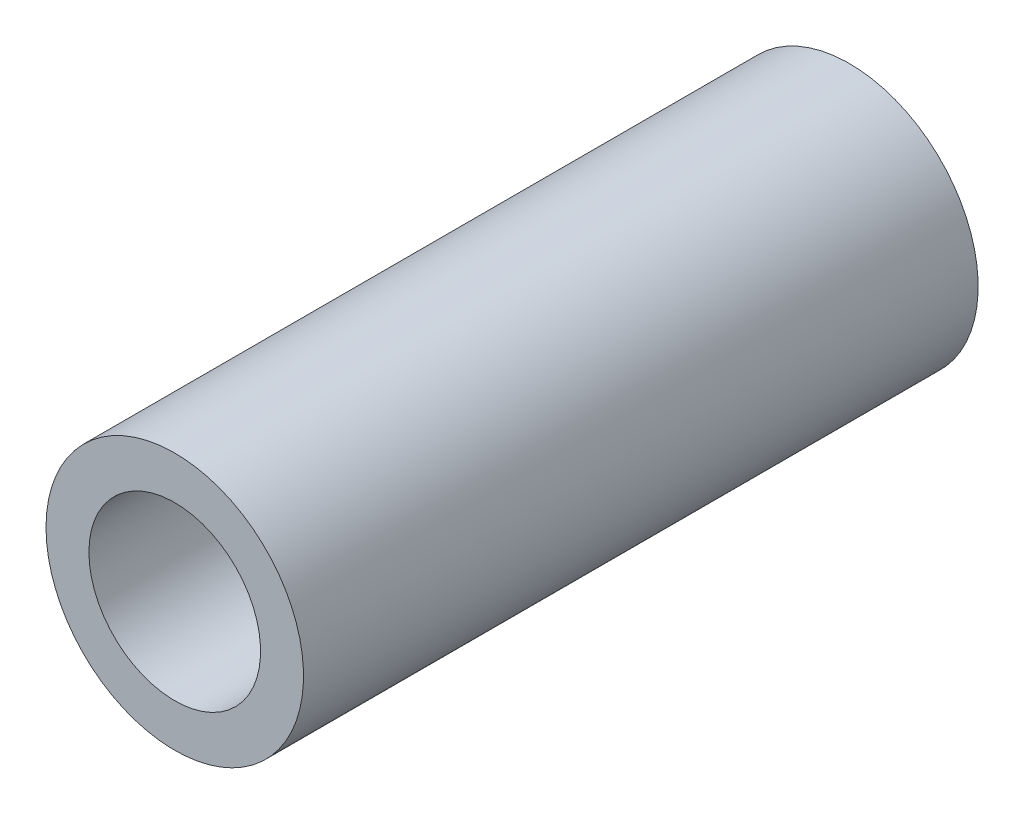
ISO-10303-21;
HEADER;
FILE_DESCRIPTION(('STEP AP214'),'2;1');
FILE_NAME('part.step','',(''),(''),'','','');
FILE_SCHEMA(('AUTOMOTIVE_DESIGN { 1 0 10303 214 1 1 1 1 }'));
ENDSEC;
DATA;
#1=APPLICATION_CONTEXT('core data for automotive mechanical design processes');
#2=APPLICATION_PROTOCOL_DEFINITION('international standard','automotive_design',2000,#1);
#3=PRODUCT_CONTEXT('',#1,'mechanical');
#4=PRODUCT('Part','Part','',(#3));
#5=PRODUCT_RELATED_PRODUCT_CATEGORY('part','',(#4));
#6=PRODUCT_DEFINITION_FORMATION('','',#4);
#7=PRODUCT_DEFINITION_CONTEXT('part definition',#1,'design');
#8=PRODUCT_DEFINITION('design','',#6,#7);
#9=PRODUCT_DEFINITION_SHAPE('','',#8);
#10=(LENGTH_UNIT() NAMED_UNIT(*) SI_UNIT(.MILLI.,.METRE.));
#11=(NAMED_UNIT(*) PLANE_ANGLE_UNIT() SI_UNIT($,.RADIAN.));
#12=(NAMED_UNIT(*) SI_UNIT($,.STERADIAN.) SOLID_ANGLE_UNIT());
#13=UNCERTAINTY_MEASURE_WITH_UNIT(LENGTH_MEASURE(1.E-05),#10,'distance_accuracy_value','');
#14=(GEOMETRIC_REPRESENTATION_CONTEXT(3) GLOBAL_UNCERTAINTY_ASSIGNED_CONTEXT((#13)) GLOBAL_UNIT_ASSIGNED_CONTEXT((#10,
#11,#12)) REPRESENTATION_CONTEXT('',''));
#15=CARTESIAN_POINT('',(0.,0.,0.));
#16=DIRECTION('',(0.,0.,1.));
#17=DIRECTION('',(1.,0.,0.));
#18=AXIS2_PLACEMENT_3D('',#15,#16,#17);
#19=CARTESIAN_POINT('',(0.,0.,12.47775));
#20=DIRECTION('',(0.,0.,1.));
#21=DIRECTION('',(1.,0.,0.));
#22=AXIS2_PLACEMENT_3D('',#19,#20,#21);
#23=PLANE('',#22);
#24=CARTESIAN_POINT('',(0.,0.,12.47775));
#25=DIRECTION('',(0.,0.,1.));
#26=DIRECTION('',(1.,0.,0.));
#27=AXIS2_PLACEMENT_3D('',#24,#25,#26);
#28=CIRCLE('',#27,2.38125);
#29=CARTESIAN_POINT('',(-2.38125,0.,12.47775));
#30=VERTEX_POINT('',#29);
#31=EDGE_CURVE('E10',#30,#30,#28,.T.);
#32=ORIENTED_EDGE('',*,*,#31,.T.);
#33=EDGE_LOOP('',(#32));
#34=FACE_BOUND('',#33,.T.);
#35=CARTESIAN_POINT('',(0.,0.,12.47775));
#36=DIRECTION('',(0.,0.,1.));
#37=DIRECTION('',(1.,0.,0.));
#38=AXIS2_PLACEMENT_3D('',#35,#36,#37);
#39=CIRCLE('',#38,1.5875);
#40=CARTESIAN_POINT('',(-1.5875,0.,12.47775));
#41=VERTEX_POINT('',#40);
#42=EDGE_CURVE('E56',#41,#41,#39,.T.);
#43=ORIENTED_EDGE('',*,*,#42,.F.);
#44=EDGE_LOOP('',(#43));
#45=FACE_BOUND('',#44,.T.);
#46=ADVANCED_FACE('F43',(#34,#45),#23,.T.);
#47=CARTESIAN_POINT('',(0.,0.,0.));
#48=DIRECTION('',(0.,0.,1.));
#49=DIRECTION('',(1.,0.,0.));
#50=AXIS2_PLACEMENT_3D('',#47,#48,#49);
#51=PLANE('',#50);
#52=CARTESIAN_POINT('',(0.,0.,0.));
#53=DIRECTION('',(0.,0.,1.));
#54=DIRECTION('',(1.,0.,0.));
#55=AXIS2_PLACEMENT_3D('',#52,#53,#54);
#56=CIRCLE('',#55,2.38125);
#57=CARTESIAN_POINT('',(-2.38125,0.,0.));
#58=VERTEX_POINT('',#57);
#59=EDGE_CURVE('E47',#58,#58,#56,.T.);
#60=ORIENTED_EDGE('',*,*,#59,.F.);
#61=EDGE_LOOP('',(#60));
#62=FACE_BOUND('',#61,.T.);
#63=CARTESIAN_POINT('',(0.,0.,0.));
#64=DIRECTION('',(0.,0.,1.));
#65=DIRECTION('',(1.,0.,0.));
#66=AXIS2_PLACEMENT_3D('',#63,#64,#65);
#67=CIRCLE('',#66,1.5875);
#68=CARTESIAN_POINT('',(-1.5875,0.,0.));
#69=VERTEX_POINT('',#68);
#70=EDGE_CURVE('E58',#69,#69,#67,.T.);
#71=ORIENTED_EDGE('',*,*,#70,.T.);
#72=EDGE_LOOP('',(#71));
#73=FACE_BOUND('',#72,.T.);
#74=ADVANCED_FACE('F70',(#62,#73),#51,.F.);
#75=CARTESIAN_POINT('',(0.,0.,12.47775));
#76=DIRECTION('',(0.,0.,-1.));
#77=DIRECTION('',(-1.,0.,0.));
#78=AXIS2_PLACEMENT_3D('',#75,#76,#77);
#79=CYLINDRICAL_SURFACE('',#78,2.38125);
#80=CARTESIAN_POINT('',(-2.38125,0.,12.47775));
#81=CARTESIAN_POINT('',(-2.38125,0.,12.3477734375));
#82=CARTESIAN_POINT('',(-2.38125,0.,12.217796875));
#83=CARTESIAN_POINT('',(-2.38125,0.,11.95784375));
#84=CARTESIAN_POINT('',(-2.38125,0.,11.8278671875));
#85=CARTESIAN_POINT('',(-2.38125,0.,11.5679140625));
#86=CARTESIAN_POINT('',(-2.38125,0.,11.4379375));
#87=CARTESIAN_POINT('',(-2.38125,0.,11.177984375));
#88=CARTESIAN_POINT('',(-2.38125,0.,11.0480078125));
#89=CARTESIAN_POINT('',(-2.38125,0.,10.7880546875));
#90=CARTESIAN_POINT('',(-2.38125,0.,10.658078125));
#91=CARTESIAN_POINT('',(-2.38125,0.,10.398125));
#92=CARTESIAN_POINT('',(-2.38125,0.,10.2681484375));
#93=CARTESIAN_POINT('',(-2.38125,0.,10.0081953125));
#94=CARTESIAN_POINT('',(-2.38125,0.,9.87821875));
#95=CARTESIAN_POINT('',(-2.38125,0.,9.618265625));
#96=CARTESIAN_POINT('',(-2.38125,0.,9.4882890625));
#97=CARTESIAN_POINT('',(-2.38125,0.,9.2283359375));
#98=CARTESIAN_POINT('',(-2.38125,0.,9.098359375));
#99=CARTESIAN_POINT('',(-2.38125,0.,8.83840625));
#100=CARTESIAN_POINT('',(-2.38125,0.,8.7084296875));
#101=CARTESIAN_POINT('',(-2.38125,0.,8.4484765625));
#102=CARTESIAN_POINT('',(-2.38125,0.,8.3185));
#103=CARTESIAN_POINT('',(-2.38125,0.,8.058546875));
#104=CARTESIAN_POINT('',(-2.38125,0.,7.9285703125));
#105=CARTESIAN_POINT('',(-2.38125,0.,7.6686171875));
#106=CARTESIAN_POINT('',(-2.38125,0.,7.538640625));
#107=CARTESIAN_POINT('',(-2.38125,0.,7.2786875));
#108=CARTESIAN_POINT('',(-2.38125,0.,7.1487109375));
#109=CARTESIAN_POINT('',(-2.38125,0.,6.8887578125));
#110=CARTESIAN_POINT('',(-2.38125,0.,6.75878125));
#111=CARTESIAN_POINT('',(-2.38125,0.,6.498828125));
#112=CARTESIAN_POINT('',(-2.38125,0.,6.3688515625));
#113=CARTESIAN_POINT('',(-2.38125,0.,6.1088984375));
#114=CARTESIAN_POINT('',(-2.38125,0.,5.978921875));
#115=CARTESIAN_POINT('',(-2.38125,0.,5.71896875));
#116=CARTESIAN_POINT('',(-2.38125,0.,5.5889921875));
#117=CARTESIAN_POINT('',(-2.38125,0.,5.3290390625));
#118=CARTESIAN_POINT('',(-2.38125,0.,5.1990625));
#119=CARTESIAN_POINT('',(-2.38125,0.,4.939109375));
#120=CARTESIAN_POINT('',(-2.38125,0.,4.8091328125));
#121=CARTESIAN_POINT('',(-2.38125,0.,4.5491796875));
#122=CARTESIAN_POINT('',(-2.38125,0.,4.419203125));
#123=CARTESIAN_POINT('',(-2.38125,0.,4.15925));
#124=CARTESIAN_POINT('',(-2.38125,0.,4.0292734375));
#125=CARTESIAN_POINT('',(-2.38125,0.,3.7693203125));
#126=CARTESIAN_POINT('',(-2.38125,0.,3.63934375));
#127=CARTESIAN_POINT('',(-2.38125,0.,3.379390625));
#128=CARTESIAN_POINT('',(-2.38125,0.,3.2494140625));
#129=CARTESIAN_POINT('',(-2.38125,0.,2.9894609375));
#130=CARTESIAN_POINT('',(-2.38125,0.,2.859484375));
#131=CARTESIAN_POINT('',(-2.38125,0.,2.59953125));
#132=CARTESIAN_POINT('',(-2.38125,0.,2.4695546875));
#133=CARTESIAN_POINT('',(-2.38125,0.,2.2096015625));
#134=CARTESIAN_POINT('',(-2.38125,0.,2.079625));
#135=CARTESIAN_POINT('',(-2.38125,0.,1.819671875));
#136=CARTESIAN_POINT('',(-2.38125,0.,1.6896953125));
#137=CARTESIAN_POINT('',(-2.38125,0.,1.4297421875));
#138=CARTESIAN_POINT('',(-2.38125,0.,1.299765625));
#139=CARTESIAN_POINT('',(-2.38125,0.,1.0398125));
#140=CARTESIAN_POINT('',(-2.38125,0.,0.909835937500001));
#141=CARTESIAN_POINT('',(-2.38125,0.,0.6498828125));
#142=CARTESIAN_POINT('',(-2.38125,0.,0.51990625));
#143=CARTESIAN_POINT('',(-2.38125,0.,0.259953125));
#144=CARTESIAN_POINT('',(-2.38125,0.,0.1299765625));
#145=CARTESIAN_POINT('',(-2.38125,0.,0.));
#146=B_SPLINE_CURVE_WITH_KNOTS('',3,(#80,#81,#82,#83,#84,#85,#86,#87,#88,#89,#90,#91,#92,#93,
#94,#95,#96,#97,#98,#99,#100,#101,#102,#103,#104,#105,#106,#107,#108,#109,#110,#111,#112,#113,
#114,#115,#116,#117,#118,#119,#120,#121,#122,#123,#124,#125,#126,#127,#128,#129,#130,#131,#132,
#133,#134,#135,#136,#137,#138,#139,#140,#141,#142,#143,#144,#145),.UNSPECIFIED.,.F.,.F.,(4,2,2,
2,2,2,2,2,2,2,2,2,2,2,2,2,2,2,2,2,2,2,2,2,2,2,2,2,2,2,2,2,4),(0.,0.389929687499999,
0.779859374999999,1.1697890625,1.55971875,1.9496484375,2.339578125,2.7295078125,3.1194375,
3.5093671875,3.899296875,4.2892265625,4.67915625,5.0690859375,5.459015625,5.8489453125,6.238875,
6.6288046875,7.018734375,7.4086640625,7.79859375,8.1885234375,8.578453125,8.9683828125,
9.3583125,9.7482421875,10.138171875,10.5281015625,10.91803125,11.3079609375,11.697890625,
12.0878203125,12.47775),.UNSPECIFIED.);
#147=EDGE_CURVE('BSEAM45',#30,#58,#146,.T.);
#148=ORIENTED_EDGE('',*,*,#31,.F.);
#149=ORIENTED_EDGE('',*,*,#59,.T.);
#150=ORIENTED_EDGE('',*,*,#147,.T.);
#151=ORIENTED_EDGE('',*,*,#147,.F.);
#152=EDGE_LOOP('',(#148,#150,#149,#151));
#153=FACE_BOUND('',#152,.T.);
#154=ADVANCED_FACE('F45',(#153),#79,.T.);
#155=CARTESIAN_POINT('',(0.,0.,12.47775));
#156=DIRECTION('',(0.,0.,-1.));
#157=DIRECTION('',(-1.,0.,0.));
#158=AXIS2_PLACEMENT_3D('',#155,#156,#157);
#159=CYLINDRICAL_SURFACE('',#158,1.5875);
#160=CARTESIAN_POINT('',(-1.5875,0.,12.47775));
#161=CARTESIAN_POINT('',(-1.5875,0.,12.3477734375));
#162=CARTESIAN_POINT('',(-1.5875,0.,12.217796875));
#163=CARTESIAN_POINT('',(-1.5875,0.,11.95784375));
#164=CARTESIAN_POINT('',(-1.5875,0.,11.8278671875));
#165=CARTESIAN_POINT('',(-1.5875,0.,11.5679140625));
#166=CARTESIAN_POINT('',(-1.5875,0.,11.4379375));
#167=CARTESIAN_POINT('',(-1.5875,0.,11.177984375));
#168=CARTESIAN_POINT('',(-1.5875,0.,11.0480078125));
#169=CARTESIAN_POINT('',(-1.5875,0.,10.7880546875));
#170=CARTESIAN_POINT('',(-1.5875,0.,10.658078125));
#171=CARTESIAN_POINT('',(-1.5875,0.,10.398125));
#172=CARTESIAN_POINT('',(-1.5875,0.,10.2681484375));
#173=CARTESIAN_POINT('',(-1.5875,0.,10.0081953125));
#174=CARTESIAN_POINT('',(-1.5875,0.,9.87821875));
#175=CARTESIAN_POINT('',(-1.5875,0.,9.618265625));
#176=CARTESIAN_POINT('',(-1.5875,0.,9.4882890625));
#177=CARTESIAN_POINT('',(-1.5875,0.,9.2283359375));
#178=CARTESIAN_POINT('',(-1.5875,0.,9.098359375));
#179=CARTESIAN_POINT('',(-1.5875,0.,8.83840625));
#180=CARTESIAN_POINT('',(-1.5875,0.,8.7084296875));
#181=CARTESIAN_POINT('',(-1.5875,0.,8.4484765625));
#182=CARTESIAN_POINT('',(-1.5875,0.,8.3185));
#183=CARTESIAN_POINT('',(-1.5875,0.,8.058546875));
#184=CARTESIAN_POINT('',(-1.5875,0.,7.9285703125));
#185=CARTESIAN_POINT('',(-1.5875,0.,7.6686171875));
#186=CARTESIAN_POINT('',(-1.5875,0.,7.538640625));
#187=CARTESIAN_POINT('',(-1.5875,0.,7.2786875));
#188=CARTESIAN_POINT('',(-1.5875,0.,7.1487109375));
#189=CARTESIAN_POINT('',(-1.5875,0.,6.8887578125));
#190=CARTESIAN_POINT('',(-1.5875,0.,6.75878125));
#191=CARTESIAN_POINT('',(-1.5875,0.,6.498828125));
#192=CARTESIAN_POINT('',(-1.5875,0.,6.3688515625));
#193=CARTESIAN_POINT('',(-1.5875,0.,6.1088984375));
#194=CARTESIAN_POINT('',(-1.5875,0.,5.978921875));
#195=CARTESIAN_POINT('',(-1.5875,0.,5.71896875));
#196=CARTESIAN_POINT('',(-1.5875,0.,5.5889921875));
#197=CARTESIAN_POINT('',(-1.5875,0.,5.3290390625));
#198=CARTESIAN_POINT('',(-1.5875,0.,5.1990625));
#199=CARTESIAN_POINT('',(-1.5875,0.,4.939109375));
#200=CARTESIAN_POINT('',(-1.5875,0.,4.8091328125));
#201=CARTESIAN_POINT('',(-1.5875,0.,4.5491796875));
#202=CARTESIAN_POINT('',(-1.5875,0.,4.419203125));
#203=CARTESIAN_POINT('',(-1.5875,0.,4.15925));
#204=CARTESIAN_POINT('',(-1.5875,0.,4.0292734375));
#205=CARTESIAN_POINT('',(-1.5875,0.,3.7693203125));
#206=CARTESIAN_POINT('',(-1.5875,0.,3.63934375));
#207=CARTESIAN_POINT('',(-1.5875,0.,3.379390625));
#208=CARTESIAN_POINT('',(-1.5875,0.,3.2494140625));
#209=CARTESIAN_POINT('',(-1.5875,0.,2.9894609375));
#210=CARTESIAN_POINT('',(-1.5875,0.,2.859484375));
#211=CARTESIAN_POINT('',(-1.5875,0.,2.59953125));
#212=CARTESIAN_POINT('',(-1.5875,0.,2.4695546875));
#213=CARTESIAN_POINT('',(-1.5875,0.,2.2096015625));
#214=CARTESIAN_POINT('',(-1.5875,0.,2.079625));
#215=CARTESIAN_POINT('',(-1.5875,0.,1.819671875));
#216=CARTESIAN_POINT('',(-1.5875,0.,1.6896953125));
#217=CARTESIAN_POINT('',(-1.5875,0.,1.4297421875));
#218=CARTESIAN_POINT('',(-1.5875,0.,1.299765625));
#219=CARTESIAN_POINT('',(-1.5875,0.,1.0398125));
#220=CARTESIAN_POINT('',(-1.5875,0.,0.909835937500001));
#221=CARTESIAN_POINT('',(-1.5875,0.,0.6498828125));
#222=CARTESIAN_POINT('',(-1.5875,0.,0.51990625));
#223=CARTESIAN_POINT('',(-1.5875,0.,0.259953125));
#224=CARTESIAN_POINT('',(-1.5875,0.,0.1299765625));
#225=CARTESIAN_POINT('',(-1.5875,0.,0.));
#226=B_SPLINE_CURVE_WITH_KNOTS('',3,(#160,#161,#162,#163,#164,#165,#166,#167,#168,#169,#170,
#171,#172,#173,#174,#175,#176,#177,#178,#179,#180,#181,#182,#183,#184,#185,#186,#187,#188,#189,
#190,#191,#192,#193,#194,#195,#196,#197,#198,#199,#200,#201,#202,#203,#204,#205,#206,#207,#208,
#209,#210,#211,#212,#213,#214,#215,#216,#217,#218,#219,#220,#221,#222,#223,#224,#225),
.UNSPECIFIED.,.F.,.F.,(4,2,2,2,2,2,2,2,2,2,2,2,2,2,2,2,2,2,2,2,2,2,2,2,2,2,2,2,2,2,2,2,4),(0.,
0.3899296875,0.779859375000001,1.1697890625,1.55971875,1.9496484375,2.339578125,2.7295078125,
3.1194375,3.5093671875,3.899296875,4.2892265625,4.67915625,5.0690859375,5.459015625,
5.8489453125,6.238875,6.6288046875,7.018734375,7.4086640625,7.79859375,8.1885234375,8.578453125,
8.9683828125,9.3583125,9.7482421875,10.138171875,10.5281015625,10.91803125,11.3079609375,
11.697890625,12.0878203125,12.47775),.UNSPECIFIED.);
#227=EDGE_CURVE('BSEAM66',#41,#69,#226,.T.);
#228=ORIENTED_EDGE('',*,*,#42,.T.);
#229=ORIENTED_EDGE('',*,*,#70,.F.);
#230=ORIENTED_EDGE('',*,*,#227,.T.);
#231=ORIENTED_EDGE('',*,*,#227,.F.);
#232=EDGE_LOOP('',(#228,#230,#229,#231));
#233=FACE_BOUND('',#232,.T.);
#234=ADVANCED_FACE('F66',(#233),#159,.F.);
#235=CLOSED_SHELL('',(#46,#74,#154,#234));
#236=MANIFOLD_SOLID_BREP('B2',#235);
#237=ADVANCED_BREP_SHAPE_REPRESENTATION('',(#18,#236),#14);
#238=SHAPE_DEFINITION_REPRESENTATION(#9,#237);
ENDSEC;
END-ISO-10303-21;
